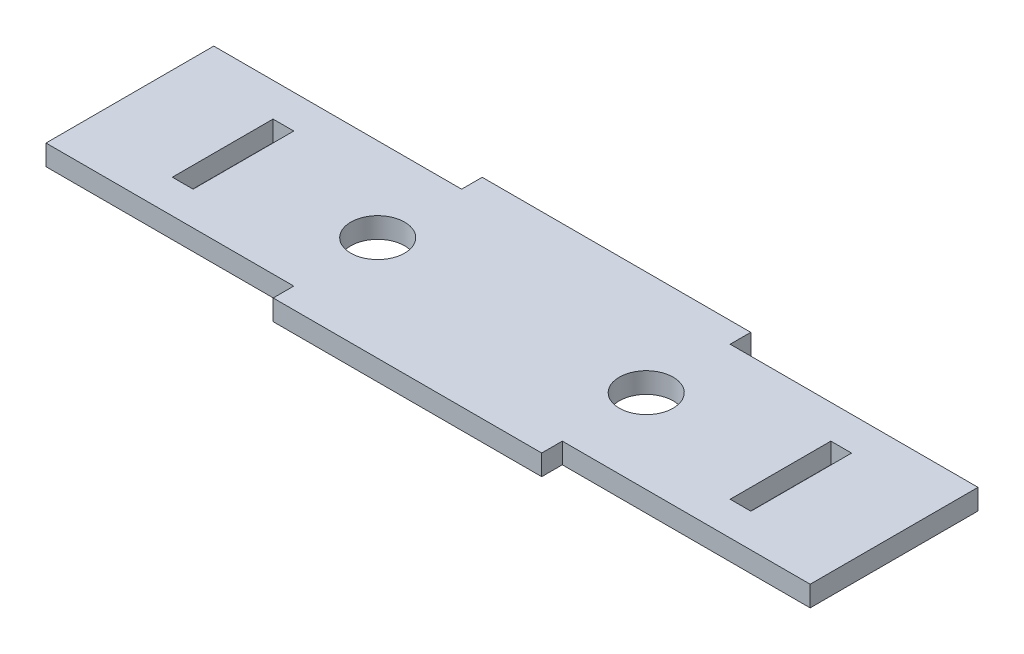
ISO-10303-21;
HEADER;
FILE_DESCRIPTION(('STEP AP214'),'2;1');
FILE_NAME('part.step','',(''),(''),'','','');
FILE_SCHEMA(('AUTOMOTIVE_DESIGN { 1 0 10303 214 1 1 1 1 }'));
ENDSEC;
DATA;
#1=APPLICATION_CONTEXT('core data for automotive mechanical design processes');
#2=APPLICATION_PROTOCOL_DEFINITION('international standard','automotive_design',2000,#1);
#3=PRODUCT_CONTEXT('',#1,'mechanical');
#4=PRODUCT('Part','Part','',(#3));
#5=PRODUCT_RELATED_PRODUCT_CATEGORY('part','',(#4));
#6=PRODUCT_DEFINITION_FORMATION('','',#4);
#7=PRODUCT_DEFINITION_CONTEXT('part definition',#1,'design');
#8=PRODUCT_DEFINITION('design','',#6,#7);
#9=PRODUCT_DEFINITION_SHAPE('','',#8);
#10=(LENGTH_UNIT() NAMED_UNIT(*) SI_UNIT(.MILLI.,.METRE.));
#11=(NAMED_UNIT(*) PLANE_ANGLE_UNIT() SI_UNIT($,.RADIAN.));
#12=(NAMED_UNIT(*) SI_UNIT($,.STERADIAN.) SOLID_ANGLE_UNIT());
#13=UNCERTAINTY_MEASURE_WITH_UNIT(LENGTH_MEASURE(1.E-05),#10,'distance_accuracy_value','');
#14=(GEOMETRIC_REPRESENTATION_CONTEXT(3) GLOBAL_UNCERTAINTY_ASSIGNED_CONTEXT((#13)) GLOBAL_UNIT_ASSIGNED_CONTEXT((#10,
#11,#12)) REPRESENTATION_CONTEXT('',''));
#15=CARTESIAN_POINT('',(0.,0.,0.));
#16=DIRECTION('',(0.,0.,1.));
#17=DIRECTION('',(1.,0.,0.));
#18=AXIS2_PLACEMENT_3D('',#15,#16,#17);
#19=CARTESIAN_POINT('',(-20.,-54.98,-1.));
#20=DIRECTION('',(0.,0.,-1.));
#21=DIRECTION('',(-1.,0.,0.));
#22=AXIS2_PLACEMENT_3D('',#19,#20,#21);
#23=PLANE('',#22);
#24=DIRECTION('',(-1.,0.,0.));
#25=VECTOR('',#24,1.);
#26=CARTESIAN_POINT('',(-20.,-51.92,-1.));
#27=LINE('',#26,#25);
#28=CARTESIAN_POINT('',(20.,-51.92,-0.999999999999994));
#29=VERTEX_POINT('',#28);
#30=CARTESIAN_POINT('',(-20.,-51.92,-1.));
#31=VERTEX_POINT('',#30);
#32=EDGE_CURVE('E212',#29,#31,#27,.T.);
#33=ORIENTED_EDGE('',*,*,#32,.T.);
#34=DIRECTION('',(0.,1.,0.));
#35=VECTOR('',#34,1.);
#36=CARTESIAN_POINT('',(-20.,-54.98,-1.));
#37=LINE('',#36,#35);
#38=CARTESIAN_POINT('',(-20.,-54.98,-1.));
#39=VERTEX_POINT('',#38);
#40=EDGE_CURVE('E315',#39,#31,#37,.T.);
#41=ORIENTED_EDGE('',*,*,#40,.F.);
#42=DIRECTION('',(-1.,0.,0.));
#43=VECTOR('',#42,1.);
#44=CARTESIAN_POINT('',(-20.,-54.98,-1.));
#45=LINE('',#44,#43);
#46=CARTESIAN_POINT('',(20.,-54.98,-0.999999999999994));
#47=VERTEX_POINT('',#46);
#48=EDGE_CURVE('E233',#47,#39,#45,.T.);
#49=ORIENTED_EDGE('',*,*,#48,.F.);
#50=DIRECTION('',(0.,1.,0.));
#51=VECTOR('',#50,1.);
#52=CARTESIAN_POINT('',(20.,-54.98,-0.999999999999994));
#53=LINE('',#52,#51);
#54=EDGE_CURVE('E259',#47,#29,#53,.T.);
#55=ORIENTED_EDGE('',*,*,#54,.T.);
#56=EDGE_LOOP('',(#33,#41,#49,#55));
#57=FACE_BOUND('',#56,.T.);
#58=ADVANCED_FACE('F43',(#57),#23,.F.);
#59=CARTESIAN_POINT('',(-20.,-54.98,-1.));
#60=DIRECTION('',(1.,0.,0.));
#61=DIRECTION('',(0.,0.,-1.));
#62=AXIS2_PLACEMENT_3D('',#59,#60,#61);
#63=PLANE('',#62);
#64=DIRECTION('',(0.,0.,-1.));
#65=VECTOR('',#64,1.);
#66=CARTESIAN_POINT('',(-20.,-51.92,-1.));
#67=LINE('',#66,#65);
#68=CARTESIAN_POINT('',(-20.,-51.92,-4.07));
#69=VERTEX_POINT('',#68);
#70=EDGE_CURVE('E262',#31,#69,#67,.T.);
#71=ORIENTED_EDGE('',*,*,#70,.T.);
#72=DIRECTION('',(0.,1.,0.));
#73=VECTOR('',#72,1.);
#74=CARTESIAN_POINT('',(-20.,-54.98,-4.07));
#75=LINE('',#74,#73);
#76=CARTESIAN_POINT('',(-20.,-54.98,-4.07));
#77=VERTEX_POINT('',#76);
#78=EDGE_CURVE('E312',#77,#69,#75,.T.);
#79=ORIENTED_EDGE('',*,*,#78,.F.);
#80=DIRECTION('',(0.,0.,-1.));
#81=VECTOR('',#80,1.);
#82=CARTESIAN_POINT('',(-20.,-54.98,-1.));
#83=LINE('',#82,#81);
#84=EDGE_CURVE('E236',#39,#77,#83,.T.);
#85=ORIENTED_EDGE('',*,*,#84,.F.);
#86=ORIENTED_EDGE('',*,*,#40,.T.);
#87=EDGE_LOOP('',(#71,#79,#85,#86));
#88=FACE_BOUND('',#87,.T.);
#89=ADVANCED_FACE('F370',(#88),#63,.F.);
#90=CARTESIAN_POINT('',(-20.,-54.98,-4.07));
#91=DIRECTION('',(0.,0.,-1.));
#92=DIRECTION('',(-1.,0.,0.));
#93=AXIS2_PLACEMENT_3D('',#90,#91,#92);
#94=PLANE('',#93);
#95=DIRECTION('',(-1.,0.,0.));
#96=VECTOR('',#95,1.);
#97=CARTESIAN_POINT('',(-20.,-51.92,-4.07));
#98=LINE('',#97,#96);
#99=CARTESIAN_POINT('',(-56.91,-51.92,-4.07));
#100=VERTEX_POINT('',#99);
#101=EDGE_CURVE('E264',#69,#100,#98,.T.);
#102=ORIENTED_EDGE('',*,*,#101,.T.);
#103=DIRECTION('',(0.,1.,0.));
#104=VECTOR('',#103,1.);
#105=CARTESIAN_POINT('',(-56.91,-54.98,-4.07));
#106=LINE('',#105,#104);
#107=CARTESIAN_POINT('',(-56.91,-54.98,-4.07));
#108=VERTEX_POINT('',#107);
#109=EDGE_CURVE('E309',#108,#100,#106,.T.);
#110=ORIENTED_EDGE('',*,*,#109,.F.);
#111=DIRECTION('',(-1.,0.,0.));
#112=VECTOR('',#111,1.);
#113=CARTESIAN_POINT('',(-20.,-54.98,-4.07));
#114=LINE('',#113,#112);
#115=EDGE_CURVE('E239',#77,#108,#114,.T.);
#116=ORIENTED_EDGE('',*,*,#115,.F.);
#117=ORIENTED_EDGE('',*,*,#78,.T.);
#118=EDGE_LOOP('',(#102,#110,#116,#117));
#119=FACE_BOUND('',#118,.T.);
#120=ADVANCED_FACE('F376',(#119),#94,.F.);
#121=CARTESIAN_POINT('',(-56.91,-54.98,-4.07));
#122=DIRECTION('',(0.99999992000001,0.,-0.000399999968002624));
#123=DIRECTION('',(-0.000399999968002624,0.,-0.99999992000001));
#124=AXIS2_PLACEMENT_3D('',#121,#122,#123);
#125=PLANE('',#124);
#126=DIRECTION('',(-0.000399999968002624,0.,-0.999999920000009));
#127=VECTOR('',#126,1.);
#128=CARTESIAN_POINT('',(-56.91,-51.92,-4.07));
#129=LINE('',#128,#127);
#130=CARTESIAN_POINT('',(-56.92,-51.92,-29.07));
#131=VERTEX_POINT('',#130);
#132=EDGE_CURVE('E266',#100,#131,#129,.T.);
#133=ORIENTED_EDGE('',*,*,#132,.T.);
#134=DIRECTION('',(0.,1.,0.));
#135=VECTOR('',#134,1.);
#136=CARTESIAN_POINT('',(-56.92,-54.98,-29.07));
#137=LINE('',#136,#135);
#138=CARTESIAN_POINT('',(-56.92,-54.98,-29.07));
#139=VERTEX_POINT('',#138);
#140=EDGE_CURVE('E306',#139,#131,#137,.T.);
#141=ORIENTED_EDGE('',*,*,#140,.F.);
#142=DIRECTION('',(-0.000399999968002624,0.,-0.999999920000009));
#143=VECTOR('',#142,1.);
#144=CARTESIAN_POINT('',(-56.91,-54.98,-4.07));
#145=LINE('',#144,#143);
#146=EDGE_CURVE('E241',#108,#139,#145,.T.);
#147=ORIENTED_EDGE('',*,*,#146,.F.);
#148=ORIENTED_EDGE('',*,*,#109,.T.);
#149=EDGE_LOOP('',(#133,#141,#147,#148));
#150=FACE_BOUND('',#149,.T.);
#151=ADVANCED_FACE('F426',(#150),#125,.F.);
#152=CARTESIAN_POINT('',(-56.92,-54.98,-29.07));
#153=DIRECTION('',(0.,0.,1.));
#154=DIRECTION('',(1.,0.,0.));
#155=AXIS2_PLACEMENT_3D('',#152,#153,#154);
#156=PLANE('',#155);
#157=DIRECTION('',(1.,0.,0.));
#158=VECTOR('',#157,1.);
#159=CARTESIAN_POINT('',(-56.92,-51.92,-29.07));
#160=LINE('',#159,#158);
#161=CARTESIAN_POINT('',(-20.,-51.92,-29.07));
#162=VERTEX_POINT('',#161);
#163=EDGE_CURVE('E268',#131,#162,#160,.T.);
#164=ORIENTED_EDGE('',*,*,#163,.T.);
#165=DIRECTION('',(0.,1.,0.));
#166=VECTOR('',#165,1.);
#167=CARTESIAN_POINT('',(-20.,-54.98,-29.07));
#168=LINE('',#167,#166);
#169=CARTESIAN_POINT('',(-20.,-54.98,-29.07));
#170=VERTEX_POINT('',#169);
#171=EDGE_CURVE('E303',#170,#162,#168,.T.);
#172=ORIENTED_EDGE('',*,*,#171,.F.);
#173=DIRECTION('',(1.,0.,0.));
#174=VECTOR('',#173,1.);
#175=CARTESIAN_POINT('',(-56.92,-54.98,-29.07));
#176=LINE('',#175,#174);
#177=EDGE_CURVE('E243',#139,#170,#176,.T.);
#178=ORIENTED_EDGE('',*,*,#177,.F.);
#179=ORIENTED_EDGE('',*,*,#140,.T.);
#180=EDGE_LOOP('',(#164,#172,#178,#179));
#181=FACE_BOUND('',#180,.T.);
#182=ADVANCED_FACE('F423',(#181),#156,.F.);
#183=CARTESIAN_POINT('',(-20.,-54.98,-32.14));
#184=DIRECTION('',(1.,0.,0.));
#185=DIRECTION('',(0.,0.,-1.));
#186=AXIS2_PLACEMENT_3D('',#183,#184,#185);
#187=PLANE('',#186);
#188=DIRECTION('',(0.,0.,-1.));
#189=VECTOR('',#188,1.);
#190=CARTESIAN_POINT('',(-20.,-51.92,-32.14));
#191=LINE('',#190,#189);
#192=CARTESIAN_POINT('',(-20.,-51.92,-32.14));
#193=VERTEX_POINT('',#192);
#194=EDGE_CURVE('E270',#162,#193,#191,.T.);
#195=ORIENTED_EDGE('',*,*,#194,.T.);
#196=DIRECTION('',(0.,1.,0.));
#197=VECTOR('',#196,1.);
#198=CARTESIAN_POINT('',(-20.,-54.98,-32.14));
#199=LINE('',#198,#197);
#200=CARTESIAN_POINT('',(-20.,-54.98,-32.14));
#201=VERTEX_POINT('',#200);
#202=EDGE_CURVE('E300',#201,#193,#199,.T.);
#203=ORIENTED_EDGE('',*,*,#202,.F.);
#204=DIRECTION('',(0.,0.,-1.));
#205=VECTOR('',#204,1.);
#206=CARTESIAN_POINT('',(-20.,-54.98,-32.14));
#207=LINE('',#206,#205);
#208=EDGE_CURVE('E245',#170,#201,#207,.T.);
#209=ORIENTED_EDGE('',*,*,#208,.F.);
#210=ORIENTED_EDGE('',*,*,#171,.T.);
#211=EDGE_LOOP('',(#195,#203,#209,#210));
#212=FACE_BOUND('',#211,.T.);
#213=ADVANCED_FACE('F419',(#212),#187,.F.);
#214=CARTESIAN_POINT('',(-20.,-54.98,-32.14));
#215=DIRECTION('',(0.,0.,1.));
#216=DIRECTION('',(1.,0.,0.));
#217=AXIS2_PLACEMENT_3D('',#214,#215,#216);
#218=PLANE('',#217);
#219=DIRECTION('',(1.,0.,0.));
#220=VECTOR('',#219,1.);
#221=CARTESIAN_POINT('',(-20.,-51.92,-32.14));
#222=LINE('',#221,#220);
#223=CARTESIAN_POINT('',(20.,-51.92,-32.14));
#224=VERTEX_POINT('',#223);
#225=EDGE_CURVE('E272',#193,#224,#222,.T.);
#226=ORIENTED_EDGE('',*,*,#225,.T.);
#227=DIRECTION('',(0.,1.,0.));
#228=VECTOR('',#227,1.);
#229=CARTESIAN_POINT('',(20.,-54.98,-32.14));
#230=LINE('',#229,#228);
#231=CARTESIAN_POINT('',(20.,-54.98,-32.14));
#232=VERTEX_POINT('',#231);
#233=EDGE_CURVE('E297',#232,#224,#230,.T.);
#234=ORIENTED_EDGE('',*,*,#233,.F.);
#235=DIRECTION('',(1.,0.,0.));
#236=VECTOR('',#235,1.);
#237=CARTESIAN_POINT('',(-20.,-54.98,-32.14));
#238=LINE('',#237,#236);
#239=EDGE_CURVE('E247',#201,#232,#238,.T.);
#240=ORIENTED_EDGE('',*,*,#239,.F.);
#241=ORIENTED_EDGE('',*,*,#202,.T.);
#242=EDGE_LOOP('',(#226,#234,#240,#241));
#243=FACE_BOUND('',#242,.T.);
#244=ADVANCED_FACE('F414',(#243),#218,.F.);
#245=CARTESIAN_POINT('',(20.,-54.98,-29.07));
#246=DIRECTION('',(-1.,0.,0.));
#247=DIRECTION('',(0.,0.,1.));
#248=AXIS2_PLACEMENT_3D('',#245,#246,#247);
#249=PLANE('',#248);
#250=DIRECTION('',(0.,0.,1.));
#251=VECTOR('',#250,1.);
#252=CARTESIAN_POINT('',(20.,-51.92,-29.07));
#253=LINE('',#252,#251);
#254=CARTESIAN_POINT('',(20.,-51.92,-29.07));
#255=VERTEX_POINT('',#254);
#256=EDGE_CURVE('E274',#224,#255,#253,.T.);
#257=ORIENTED_EDGE('',*,*,#256,.T.);
#258=DIRECTION('',(0.,1.,0.));
#259=VECTOR('',#258,1.);
#260=CARTESIAN_POINT('',(20.,-54.98,-29.07));
#261=LINE('',#260,#259);
#262=CARTESIAN_POINT('',(20.,-54.98,-29.07));
#263=VERTEX_POINT('',#262);
#264=EDGE_CURVE('E294',#263,#255,#261,.T.);
#265=ORIENTED_EDGE('',*,*,#264,.F.);
#266=DIRECTION('',(0.,0.,1.));
#267=VECTOR('',#266,1.);
#268=CARTESIAN_POINT('',(20.,-54.98,-29.07));
#269=LINE('',#268,#267);
#270=EDGE_CURVE('E249',#232,#263,#269,.T.);
#271=ORIENTED_EDGE('',*,*,#270,.F.);
#272=ORIENTED_EDGE('',*,*,#233,.T.);
#273=EDGE_LOOP('',(#257,#265,#271,#272));
#274=FACE_BOUND('',#273,.T.);
#275=ADVANCED_FACE('F408',(#274),#249,.F.);
#276=CARTESIAN_POINT('',(20.,-54.98,-29.07));
#277=DIRECTION('',(0.,0.,1.));
#278=DIRECTION('',(1.,0.,0.));
#279=AXIS2_PLACEMENT_3D('',#276,#277,#278);
#280=PLANE('',#279);
#281=DIRECTION('',(1.,0.,0.));
#282=VECTOR('',#281,1.);
#283=CARTESIAN_POINT('',(20.,-51.92,-29.07));
#284=LINE('',#283,#282);
#285=CARTESIAN_POINT('',(56.92,-51.92,-29.07));
#286=VERTEX_POINT('',#285);
#287=EDGE_CURVE('E276',#255,#286,#284,.T.);
#288=ORIENTED_EDGE('',*,*,#287,.T.);
#289=DIRECTION('',(0.,1.,0.));
#290=VECTOR('',#289,1.);
#291=CARTESIAN_POINT('',(56.92,-54.98,-29.07));
#292=LINE('',#291,#290);
#293=CARTESIAN_POINT('',(56.92,-54.98,-29.07));
#294=VERTEX_POINT('',#293);
#295=EDGE_CURVE('E291',#294,#286,#292,.T.);
#296=ORIENTED_EDGE('',*,*,#295,.F.);
#297=DIRECTION('',(1.,0.,0.));
#298=VECTOR('',#297,1.);
#299=CARTESIAN_POINT('',(20.,-54.98,-29.07));
#300=LINE('',#299,#298);
#301=EDGE_CURVE('E251',#263,#294,#300,.T.);
#302=ORIENTED_EDGE('',*,*,#301,.F.);
#303=ORIENTED_EDGE('',*,*,#264,.T.);
#304=EDGE_LOOP('',(#288,#296,#302,#303));
#305=FACE_BOUND('',#304,.T.);
#306=ADVANCED_FACE('F404',(#305),#280,.F.);
#307=CARTESIAN_POINT('',(56.92,-54.98,-29.07));
#308=DIRECTION('',(-1.,0.,0.));
#309=DIRECTION('',(0.,0.,1.));
#310=AXIS2_PLACEMENT_3D('',#307,#308,#309);
#311=PLANE('',#310);
#312=DIRECTION('',(0.,0.,1.));
#313=VECTOR('',#312,1.);
#314=CARTESIAN_POINT('',(56.92,-51.92,-29.07));
#315=LINE('',#314,#313);
#316=CARTESIAN_POINT('',(56.92,-51.92,-4.07));
#317=VERTEX_POINT('',#316);
#318=EDGE_CURVE('E278',#286,#317,#315,.T.);
#319=ORIENTED_EDGE('',*,*,#318,.T.);
#320=DIRECTION('',(0.,1.,0.));
#321=VECTOR('',#320,1.);
#322=CARTESIAN_POINT('',(56.92,-54.98,-4.07));
#323=LINE('',#322,#321);
#324=CARTESIAN_POINT('',(56.92,-54.98,-4.07));
#325=VERTEX_POINT('',#324);
#326=EDGE_CURVE('E288',#325,#317,#323,.T.);
#327=ORIENTED_EDGE('',*,*,#326,.F.);
#328=DIRECTION('',(0.,0.,1.));
#329=VECTOR('',#328,1.);
#330=CARTESIAN_POINT('',(56.92,-54.98,-29.07));
#331=LINE('',#330,#329);
#332=EDGE_CURVE('E253',#294,#325,#331,.T.);
#333=ORIENTED_EDGE('',*,*,#332,.F.);
#334=ORIENTED_EDGE('',*,*,#295,.T.);
#335=EDGE_LOOP('',(#319,#327,#333,#334));
#336=FACE_BOUND('',#335,.T.);
#337=ADVANCED_FACE('F399',(#336),#311,.F.);
#338=CARTESIAN_POINT('',(56.92,-54.98,-4.07));
#339=DIRECTION('',(0.,0.,-1.));
#340=DIRECTION('',(-1.,0.,0.));
#341=AXIS2_PLACEMENT_3D('',#338,#339,#340);
#342=PLANE('',#341);
#343=DIRECTION('',(-1.,0.,0.));
#344=VECTOR('',#343,1.);
#345=CARTESIAN_POINT('',(56.92,-51.92,-4.07));
#346=LINE('',#345,#344);
#347=CARTESIAN_POINT('',(20.,-51.92,-4.07));
#348=VERTEX_POINT('',#347);
#349=EDGE_CURVE('E280',#317,#348,#346,.T.);
#350=ORIENTED_EDGE('',*,*,#349,.T.);
#351=DIRECTION('',(0.,1.,0.));
#352=VECTOR('',#351,1.);
#353=CARTESIAN_POINT('',(20.,-54.98,-4.07));
#354=LINE('',#353,#352);
#355=CARTESIAN_POINT('',(20.,-54.98,-4.07));
#356=VERTEX_POINT('',#355);
#357=EDGE_CURVE('E285',#356,#348,#354,.T.);
#358=ORIENTED_EDGE('',*,*,#357,.F.);
#359=DIRECTION('',(-1.,0.,0.));
#360=VECTOR('',#359,1.);
#361=CARTESIAN_POINT('',(56.92,-54.98,-4.07));
#362=LINE('',#361,#360);
#363=EDGE_CURVE('E255',#325,#356,#362,.T.);
#364=ORIENTED_EDGE('',*,*,#363,.F.);
#365=ORIENTED_EDGE('',*,*,#326,.T.);
#366=EDGE_LOOP('',(#350,#358,#364,#365));
#367=FACE_BOUND('',#366,.T.);
#368=ADVANCED_FACE('F365',(#367),#342,.F.);
#369=CARTESIAN_POINT('',(20.,-54.98,-4.07));
#370=DIRECTION('',(-1.,0.,0.));
#371=DIRECTION('',(0.,0.,1.));
#372=AXIS2_PLACEMENT_3D('',#369,#370,#371);
#373=PLANE('',#372);
#374=DIRECTION('',(0.,0.,1.));
#375=VECTOR('',#374,1.);
#376=CARTESIAN_POINT('',(20.,-51.92,-4.07));
#377=LINE('',#376,#375);
#378=EDGE_CURVE('E237',#348,#29,#377,.T.);
#379=ORIENTED_EDGE('',*,*,#378,.T.);
#380=ORIENTED_EDGE('',*,*,#54,.F.);
#381=DIRECTION('',(0.,0.,1.));
#382=VECTOR('',#381,1.);
#383=CARTESIAN_POINT('',(20.,-54.98,-4.07));
#384=LINE('',#383,#382);
#385=EDGE_CURVE('E257',#356,#47,#384,.T.);
#386=ORIENTED_EDGE('',*,*,#385,.F.);
#387=ORIENTED_EDGE('',*,*,#357,.T.);
#388=EDGE_LOOP('',(#379,#380,#386,#387));
#389=FACE_BOUND('',#388,.T.);
#390=ADVANCED_FACE('F354',(#389),#373,.F.);
#391=CARTESIAN_POINT('',(0.,-54.98,0.));
#392=DIRECTION('',(0.,-1.,0.));
#393=DIRECTION('',(0.,0.,-1.));
#394=AXIS2_PLACEMENT_3D('',#391,#392,#393);
#395=PLANE('',#394);
#396=CARTESIAN_POINT('',(-20.,-54.98,-16.57));
#397=DIRECTION('',(0.,-1.,0.));
#398=DIRECTION('',(0.,0.,-1.));
#399=AXIS2_PLACEMENT_3D('',#396,#397,#398);
#400=CIRCLE('',#399,4.01);
#401=CARTESIAN_POINT('',(-20.,-54.98,-20.58));
#402=VERTEX_POINT('',#401);
#403=EDGE_CURVE('E336',#402,#402,#400,.T.);
#404=ORIENTED_EDGE('',*,*,#403,.F.);
#405=EDGE_LOOP('',(#404));
#406=FACE_BOUND('',#405,.T.);
#407=CARTESIAN_POINT('',(20.,-54.98,-16.57));
#408=DIRECTION('',(0.,-1.,0.));
#409=DIRECTION('',(0.,0.,1.));
#410=AXIS2_PLACEMENT_3D('',#407,#408,#409);
#411=CIRCLE('',#410,4.01);
#412=CARTESIAN_POINT('',(20.,-54.98,-12.56));
#413=VERTEX_POINT('',#412);
#414=EDGE_CURVE('E341',#413,#413,#411,.T.);
#415=ORIENTED_EDGE('',*,*,#414,.F.);
#416=EDGE_LOOP('',(#415));
#417=FACE_BOUND('',#416,.T.);
#418=DIRECTION('',(0.,0.,-1.));
#419=VECTOR('',#418,1.);
#420=CARTESIAN_POINT('',(-43.09,-54.98,-9.07));
#421=LINE('',#420,#419);
#422=CARTESIAN_POINT('',(-43.09,-54.98,-9.07));
#423=VERTEX_POINT('',#422);
#424=CARTESIAN_POINT('',(-43.09,-54.98,-24.07));
#425=VERTEX_POINT('',#424);
#426=EDGE_CURVE('E59',#423,#425,#421,.T.);
#427=ORIENTED_EDGE('',*,*,#426,.F.);
#428=DIRECTION('',(-1.,0.,0.));
#429=VECTOR('',#428,1.);
#430=CARTESIAN_POINT('',(-43.09,-54.98,-9.07));
#431=LINE('',#430,#429);
#432=CARTESIAN_POINT('',(-40.,-54.98,-9.07));
#433=VERTEX_POINT('',#432);
#434=EDGE_CURVE('E205',#433,#423,#431,.T.);
#435=ORIENTED_EDGE('',*,*,#434,.F.);
#436=DIRECTION('',(0.,0.,1.));
#437=VECTOR('',#436,1.);
#438=CARTESIAN_POINT('',(-40.,-54.98,-9.07));
#439=LINE('',#438,#437);
#440=CARTESIAN_POINT('',(-40.,-54.98,-24.07));
#441=VERTEX_POINT('',#440);
#442=EDGE_CURVE('E188',#441,#433,#439,.T.);
#443=ORIENTED_EDGE('',*,*,#442,.F.);
#444=DIRECTION('',(1.,0.,0.));
#445=VECTOR('',#444,1.);
#446=CARTESIAN_POINT('',(-43.09,-54.98,-24.07));
#447=LINE('',#446,#445);
#448=EDGE_CURVE('E198',#425,#441,#447,.T.);
#449=ORIENTED_EDGE('',*,*,#448,.F.);
#450=EDGE_LOOP('',(#427,#435,#443,#449));
#451=FACE_BOUND('',#450,.T.);
#452=DIRECTION('',(0.,0.,1.));
#453=VECTOR('',#452,1.);
#454=CARTESIAN_POINT('',(43.09,-54.98,-9.07));
#455=LINE('',#454,#453);
#456=CARTESIAN_POINT('',(43.09,-54.98,-24.07));
#457=VERTEX_POINT('',#456);
#458=CARTESIAN_POINT('',(43.09,-54.98,-9.07));
#459=VERTEX_POINT('',#458);
#460=EDGE_CURVE('E67',#457,#459,#455,.T.);
#461=ORIENTED_EDGE('',*,*,#460,.F.);
#462=DIRECTION('',(1.,0.,0.));
#463=VECTOR('',#462,1.);
#464=CARTESIAN_POINT('',(43.09,-54.98,-24.07));
#465=LINE('',#464,#463);
#466=CARTESIAN_POINT('',(40.,-54.98,-24.07));
#467=VERTEX_POINT('',#466);
#468=EDGE_CURVE('E217',#467,#457,#465,.T.);
#469=ORIENTED_EDGE('',*,*,#468,.F.);
#470=DIRECTION('',(0.,0.,-1.));
#471=VECTOR('',#470,1.);
#472=CARTESIAN_POINT('',(40.,-54.98,-9.07));
#473=LINE('',#472,#471);
#474=CARTESIAN_POINT('',(40.,-54.98,-9.07));
#475=VERTEX_POINT('',#474);
#476=EDGE_CURVE('E226',#475,#467,#473,.T.);
#477=ORIENTED_EDGE('',*,*,#476,.F.);
#478=DIRECTION('',(-1.,0.,0.));
#479=VECTOR('',#478,1.);
#480=CARTESIAN_POINT('',(43.09,-54.98,-9.07));
#481=LINE('',#480,#479);
#482=EDGE_CURVE('E229',#459,#475,#481,.T.);
#483=ORIENTED_EDGE('',*,*,#482,.F.);
#484=EDGE_LOOP('',(#461,#469,#477,#483));
#485=FACE_BOUND('',#484,.T.);
#486=ORIENTED_EDGE('',*,*,#48,.T.);
#487=ORIENTED_EDGE('',*,*,#84,.T.);
#488=ORIENTED_EDGE('',*,*,#115,.T.);
#489=ORIENTED_EDGE('',*,*,#146,.T.);
#490=ORIENTED_EDGE('',*,*,#177,.T.);
#491=ORIENTED_EDGE('',*,*,#208,.T.);
#492=ORIENTED_EDGE('',*,*,#239,.T.);
#493=ORIENTED_EDGE('',*,*,#270,.T.);
#494=ORIENTED_EDGE('',*,*,#301,.T.);
#495=ORIENTED_EDGE('',*,*,#332,.T.);
#496=ORIENTED_EDGE('',*,*,#363,.T.);
#497=ORIENTED_EDGE('',*,*,#385,.T.);
#498=EDGE_LOOP('',(#486,#487,#488,#489,#490,#491,#492,#493,#494,#495,#496,#497));
#499=FACE_BOUND('',#498,.T.);
#500=ADVANCED_FACE('F202',(#406,#417,#451,#485,#499),#395,.T.);
#501=CARTESIAN_POINT('',(0.,-51.92,0.));
#502=DIRECTION('',(0.,-1.,0.));
#503=DIRECTION('',(0.,0.,-1.));
#504=AXIS2_PLACEMENT_3D('',#501,#502,#503);
#505=PLANE('',#504);
#506=CARTESIAN_POINT('',(-20.,-51.92,-16.57));
#507=DIRECTION('',(0.,-1.,0.));
#508=DIRECTION('',(0.,0.,-1.));
#509=AXIS2_PLACEMENT_3D('',#506,#507,#508);
#510=CIRCLE('',#509,4.01);
#511=CARTESIAN_POINT('',(-20.,-51.92,-20.58));
#512=VERTEX_POINT('',#511);
#513=EDGE_CURVE('E46',#512,#512,#510,.T.);
#514=ORIENTED_EDGE('',*,*,#513,.T.);
#515=EDGE_LOOP('',(#514));
#516=FACE_BOUND('',#515,.T.);
#517=CARTESIAN_POINT('',(20.,-51.92,-16.57));
#518=DIRECTION('',(0.,-1.,0.));
#519=DIRECTION('',(0.,0.,-1.));
#520=AXIS2_PLACEMENT_3D('',#517,#518,#519);
#521=CIRCLE('',#520,4.01);
#522=CARTESIAN_POINT('',(20.,-51.92,-20.58));
#523=VERTEX_POINT('',#522);
#524=EDGE_CURVE('E334',#523,#523,#521,.T.);
#525=ORIENTED_EDGE('',*,*,#524,.T.);
#526=EDGE_LOOP('',(#525));
#527=FACE_BOUND('',#526,.T.);
#528=DIRECTION('',(-1.,0.,0.));
#529=VECTOR('',#528,1.);
#530=CARTESIAN_POINT('',(0.,-51.92,-9.07));
#531=LINE('',#530,#529);
#532=CARTESIAN_POINT('',(-40.,-51.92,-9.07));
#533=VERTEX_POINT('',#532);
#534=CARTESIAN_POINT('',(-43.09,-51.92,-9.07));
#535=VERTEX_POINT('',#534);
#536=EDGE_CURVE('E51',#533,#535,#531,.T.);
#537=ORIENTED_EDGE('',*,*,#536,.T.);
#538=DIRECTION('',(0.,0.,-1.));
#539=VECTOR('',#538,1.);
#540=CARTESIAN_POINT('',(-43.09,-51.92,0.));
#541=LINE('',#540,#539);
#542=CARTESIAN_POINT('',(-43.09,-51.92,-24.07));
#543=VERTEX_POINT('',#542);
#544=EDGE_CURVE('E11',#535,#543,#541,.T.);
#545=ORIENTED_EDGE('',*,*,#544,.T.);
#546=DIRECTION('',(1.,0.,0.));
#547=VECTOR('',#546,1.);
#548=CARTESIAN_POINT('',(0.,-51.92,-24.07));
#549=LINE('',#548,#547);
#550=CARTESIAN_POINT('',(-40.,-51.92,-24.07));
#551=VERTEX_POINT('',#550);
#552=EDGE_CURVE('E330',#543,#551,#549,.T.);
#553=ORIENTED_EDGE('',*,*,#552,.T.);
#554=DIRECTION('',(0.,0.,1.));
#555=VECTOR('',#554,1.);
#556=CARTESIAN_POINT('',(-40.,-51.92,0.));
#557=LINE('',#556,#555);
#558=EDGE_CURVE('E191',#551,#533,#557,.T.);
#559=ORIENTED_EDGE('',*,*,#558,.T.);
#560=EDGE_LOOP('',(#537,#545,#553,#559));
#561=FACE_BOUND('',#560,.T.);
#562=DIRECTION('',(1.,0.,0.));
#563=VECTOR('',#562,1.);
#564=CARTESIAN_POINT('',(0.,-51.92,-24.07));
#565=LINE('',#564,#563);
#566=CARTESIAN_POINT('',(40.,-51.92,-24.07));
#567=VERTEX_POINT('',#566);
#568=CARTESIAN_POINT('',(43.09,-51.92,-24.07));
#569=VERTEX_POINT('',#568);
#570=EDGE_CURVE('E324',#567,#569,#565,.T.);
#571=ORIENTED_EDGE('',*,*,#570,.T.);
#572=DIRECTION('',(0.,0.,1.));
#573=VECTOR('',#572,1.);
#574=CARTESIAN_POINT('',(43.09,-51.92,0.));
#575=LINE('',#574,#573);
#576=CARTESIAN_POINT('',(43.09,-51.92,-9.07));
#577=VERTEX_POINT('',#576);
#578=EDGE_CURVE('E327',#569,#577,#575,.T.);
#579=ORIENTED_EDGE('',*,*,#578,.T.);
#580=DIRECTION('',(-1.,0.,0.));
#581=VECTOR('',#580,1.);
#582=CARTESIAN_POINT('',(0.,-51.92,-9.07));
#583=LINE('',#582,#581);
#584=CARTESIAN_POINT('',(40.,-51.92,-9.07));
#585=VERTEX_POINT('',#584);
#586=EDGE_CURVE('E318',#577,#585,#583,.T.);
#587=ORIENTED_EDGE('',*,*,#586,.T.);
#588=DIRECTION('',(0.,0.,-1.));
#589=VECTOR('',#588,1.);
#590=CARTESIAN_POINT('',(40.,-51.92,0.));
#591=LINE('',#590,#589);
#592=EDGE_CURVE('E321',#585,#567,#591,.T.);
#593=ORIENTED_EDGE('',*,*,#592,.T.);
#594=EDGE_LOOP('',(#571,#579,#587,#593));
#595=FACE_BOUND('',#594,.T.);
#596=ORIENTED_EDGE('',*,*,#32,.F.);
#597=ORIENTED_EDGE('',*,*,#378,.F.);
#598=ORIENTED_EDGE('',*,*,#349,.F.);
#599=ORIENTED_EDGE('',*,*,#318,.F.);
#600=ORIENTED_EDGE('',*,*,#287,.F.);
#601=ORIENTED_EDGE('',*,*,#256,.F.);
#602=ORIENTED_EDGE('',*,*,#225,.F.);
#603=ORIENTED_EDGE('',*,*,#194,.F.);
#604=ORIENTED_EDGE('',*,*,#163,.F.);
#605=ORIENTED_EDGE('',*,*,#132,.F.);
#606=ORIENTED_EDGE('',*,*,#101,.F.);
#607=ORIENTED_EDGE('',*,*,#70,.F.);
#608=EDGE_LOOP('',(#596,#597,#598,#599,#600,#601,#602,#603,#604,#605,#606,#607));
#609=FACE_BOUND('',#608,.T.);
#610=ADVANCED_FACE('F353',(#516,#527,#561,#595,#609),#505,.F.);
#611=CARTESIAN_POINT('',(43.09,-50.98,-9.07));
#612=DIRECTION('',(1.,0.,0.));
#613=DIRECTION('',(0.,0.,-1.));
#614=AXIS2_PLACEMENT_3D('',#611,#612,#613);
#615=PLANE('',#614);
#616=DIRECTION('',(0.,-1.,0.));
#617=VECTOR('',#616,1.);
#618=CARTESIAN_POINT('',(43.09,-50.98,-24.07));
#619=LINE('',#618,#617);
#620=EDGE_CURVE('E222',#569,#457,#619,.T.);
#621=ORIENTED_EDGE('',*,*,#620,.T.);
#622=ORIENTED_EDGE('',*,*,#460,.T.);
#623=DIRECTION('',(0.,-1.,0.));
#624=VECTOR('',#623,1.);
#625=CARTESIAN_POINT('',(43.09,-50.98,-9.07));
#626=LINE('',#625,#624);
#627=EDGE_CURVE('E215',#577,#459,#626,.T.);
#628=ORIENTED_EDGE('',*,*,#627,.F.);
#629=ORIENTED_EDGE('',*,*,#578,.F.);
#630=EDGE_LOOP('',(#621,#622,#628,#629));
#631=FACE_BOUND('',#630,.T.);
#632=ADVANCED_FACE('F362',(#631),#615,.F.);
#633=CARTESIAN_POINT('',(43.09,-50.98,-24.07));
#634=DIRECTION('',(0.,0.,-1.));
#635=DIRECTION('',(-1.,0.,0.));
#636=AXIS2_PLACEMENT_3D('',#633,#634,#635);
#637=PLANE('',#636);
#638=DIRECTION('',(0.,-1.,0.));
#639=VECTOR('',#638,1.);
#640=CARTESIAN_POINT('',(40.,-50.98,-24.07));
#641=LINE('',#640,#639);
#642=EDGE_CURVE('E220',#567,#467,#641,.T.);
#643=ORIENTED_EDGE('',*,*,#642,.T.);
#644=ORIENTED_EDGE('',*,*,#468,.T.);
#645=ORIENTED_EDGE('',*,*,#620,.F.);
#646=ORIENTED_EDGE('',*,*,#570,.F.);
#647=EDGE_LOOP('',(#643,#644,#645,#646));
#648=FACE_BOUND('',#647,.T.);
#649=ADVANCED_FACE('F525',(#648),#637,.F.);
#650=CARTESIAN_POINT('',(40.,-50.98,-9.07));
#651=DIRECTION('',(-1.,0.,0.));
#652=DIRECTION('',(0.,0.,1.));
#653=AXIS2_PLACEMENT_3D('',#650,#651,#652);
#654=PLANE('',#653);
#655=DIRECTION('',(0.,-1.,0.));
#656=VECTOR('',#655,1.);
#657=CARTESIAN_POINT('',(40.,-50.98,-9.07));
#658=LINE('',#657,#656);
#659=EDGE_CURVE('E218',#585,#475,#658,.T.);
#660=ORIENTED_EDGE('',*,*,#659,.T.);
#661=ORIENTED_EDGE('',*,*,#476,.T.);
#662=ORIENTED_EDGE('',*,*,#642,.F.);
#663=ORIENTED_EDGE('',*,*,#592,.F.);
#664=EDGE_LOOP('',(#660,#661,#662,#663));
#665=FACE_BOUND('',#664,.T.);
#666=ADVANCED_FACE('F532',(#665),#654,.F.);
#667=CARTESIAN_POINT('',(43.09,-50.98,-9.07));
#668=DIRECTION('',(0.,0.,1.));
#669=DIRECTION('',(1.,0.,0.));
#670=AXIS2_PLACEMENT_3D('',#667,#668,#669);
#671=PLANE('',#670);
#672=ORIENTED_EDGE('',*,*,#627,.T.);
#673=ORIENTED_EDGE('',*,*,#482,.T.);
#674=ORIENTED_EDGE('',*,*,#659,.F.);
#675=ORIENTED_EDGE('',*,*,#586,.F.);
#676=EDGE_LOOP('',(#672,#673,#674,#675));
#677=FACE_BOUND('',#676,.T.);
#678=ADVANCED_FACE('F539',(#677),#671,.F.);
#679=CARTESIAN_POINT('',(-43.09,-50.98,-9.07));
#680=DIRECTION('',(-1.,0.,0.));
#681=DIRECTION('',(0.,0.,1.));
#682=AXIS2_PLACEMENT_3D('',#679,#680,#681);
#683=PLANE('',#682);
#684=DIRECTION('',(0.,-1.,0.));
#685=VECTOR('',#684,1.);
#686=CARTESIAN_POINT('',(-43.09,-50.98,-9.07));
#687=LINE('',#686,#685);
#688=EDGE_CURVE('E210',#535,#423,#687,.T.);
#689=ORIENTED_EDGE('',*,*,#688,.T.);
#690=ORIENTED_EDGE('',*,*,#426,.T.);
#691=DIRECTION('',(0.,-1.,0.));
#692=VECTOR('',#691,1.);
#693=CARTESIAN_POINT('',(-43.09,-50.98,-24.07));
#694=LINE('',#693,#692);
#695=EDGE_CURVE('E195',#543,#425,#694,.T.);
#696=ORIENTED_EDGE('',*,*,#695,.F.);
#697=ORIENTED_EDGE('',*,*,#544,.F.);
#698=EDGE_LOOP('',(#689,#690,#696,#697));
#699=FACE_BOUND('',#698,.T.);
#700=ADVANCED_FACE('F547',(#699),#683,.F.);
#701=CARTESIAN_POINT('',(-43.09,-50.98,-9.07));
#702=DIRECTION('',(0.,0.,1.));
#703=DIRECTION('',(1.,0.,0.));
#704=AXIS2_PLACEMENT_3D('',#701,#702,#703);
#705=PLANE('',#704);
#706=DIRECTION('',(0.,-1.,0.));
#707=VECTOR('',#706,1.);
#708=CARTESIAN_POINT('',(-40.,-50.98,-9.07));
#709=LINE('',#708,#707);
#710=EDGE_CURVE('E194',#533,#433,#709,.T.);
#711=ORIENTED_EDGE('',*,*,#710,.T.);
#712=ORIENTED_EDGE('',*,*,#434,.T.);
#713=ORIENTED_EDGE('',*,*,#688,.F.);
#714=ORIENTED_EDGE('',*,*,#536,.F.);
#715=EDGE_LOOP('',(#711,#712,#713,#714));
#716=FACE_BOUND('',#715,.T.);
#717=ADVANCED_FACE('F555',(#716),#705,.F.);
#718=CARTESIAN_POINT('',(-40.,-50.98,-9.07));
#719=DIRECTION('',(1.,0.,0.));
#720=DIRECTION('',(0.,0.,-1.));
#721=AXIS2_PLACEMENT_3D('',#718,#719,#720);
#722=PLANE('',#721);
#723=DIRECTION('',(0.,-1.,0.));
#724=VECTOR('',#723,1.);
#725=CARTESIAN_POINT('',(-40.,-50.98,-24.07));
#726=LINE('',#725,#724);
#727=EDGE_CURVE('E183',#551,#441,#726,.T.);
#728=ORIENTED_EDGE('',*,*,#727,.T.);
#729=ORIENTED_EDGE('',*,*,#442,.T.);
#730=ORIENTED_EDGE('',*,*,#710,.F.);
#731=ORIENTED_EDGE('',*,*,#558,.F.);
#732=EDGE_LOOP('',(#728,#729,#730,#731));
#733=FACE_BOUND('',#732,.T.);
#734=ADVANCED_FACE('F185',(#733),#722,.F.);
#735=CARTESIAN_POINT('',(-43.09,-50.98,-24.07));
#736=DIRECTION('',(0.,0.,-1.));
#737=DIRECTION('',(-1.,0.,0.));
#738=AXIS2_PLACEMENT_3D('',#735,#736,#737);
#739=PLANE('',#738);
#740=ORIENTED_EDGE('',*,*,#695,.T.);
#741=ORIENTED_EDGE('',*,*,#448,.T.);
#742=ORIENTED_EDGE('',*,*,#727,.F.);
#743=ORIENTED_EDGE('',*,*,#552,.F.);
#744=EDGE_LOOP('',(#740,#741,#742,#743));
#745=FACE_BOUND('',#744,.T.);
#746=ADVANCED_FACE('F199',(#745),#739,.F.);
#747=CARTESIAN_POINT('',(20.,-50.98,-16.57));
#748=DIRECTION('',(0.,-1.,0.));
#749=DIRECTION('',(0.,0.,-1.));
#750=AXIS2_PLACEMENT_3D('',#747,#748,#749);
#751=CYLINDRICAL_SURFACE('',#750,4.01);
#752=ORIENTED_EDGE('',*,*,#414,.T.);
#753=EDGE_LOOP('',(#752));
#754=FACE_BOUND('',#753,.T.);
#755=ORIENTED_EDGE('',*,*,#524,.F.);
#756=EDGE_LOOP('',(#755));
#757=FACE_BOUND('',#756,.T.);
#758=ADVANCED_FACE('F349',(#754,#757),#751,.F.);
#759=CARTESIAN_POINT('',(-20.,-50.98,-16.57));
#760=DIRECTION('',(0.,-1.,0.));
#761=DIRECTION('',(0.,0.,-1.));
#762=AXIS2_PLACEMENT_3D('',#759,#760,#761);
#763=CYLINDRICAL_SURFACE('',#762,4.01);
#764=ORIENTED_EDGE('',*,*,#403,.T.);
#765=EDGE_LOOP('',(#764));
#766=FACE_BOUND('',#765,.T.);
#767=ORIENTED_EDGE('',*,*,#513,.F.);
#768=EDGE_LOOP('',(#767));
#769=FACE_BOUND('',#768,.T.);
#770=ADVANCED_FACE('F581',(#766,#769),#763,.F.);
#771=CLOSED_SHELL('',(#58,#89,#120,#151,#182,#213,#244,#275,#306,#337,#368,#390,#500,#610,#632,
#649,#666,#678,#700,#717,#734,#746,#758,#770));
#772=MANIFOLD_SOLID_BREP('B2',#771);
#773=ADVANCED_BREP_SHAPE_REPRESENTATION('',(#18,#772),#14);
#774=SHAPE_DEFINITION_REPRESENTATION(#9,#773);
ENDSEC;
END-ISO-10303-21;
